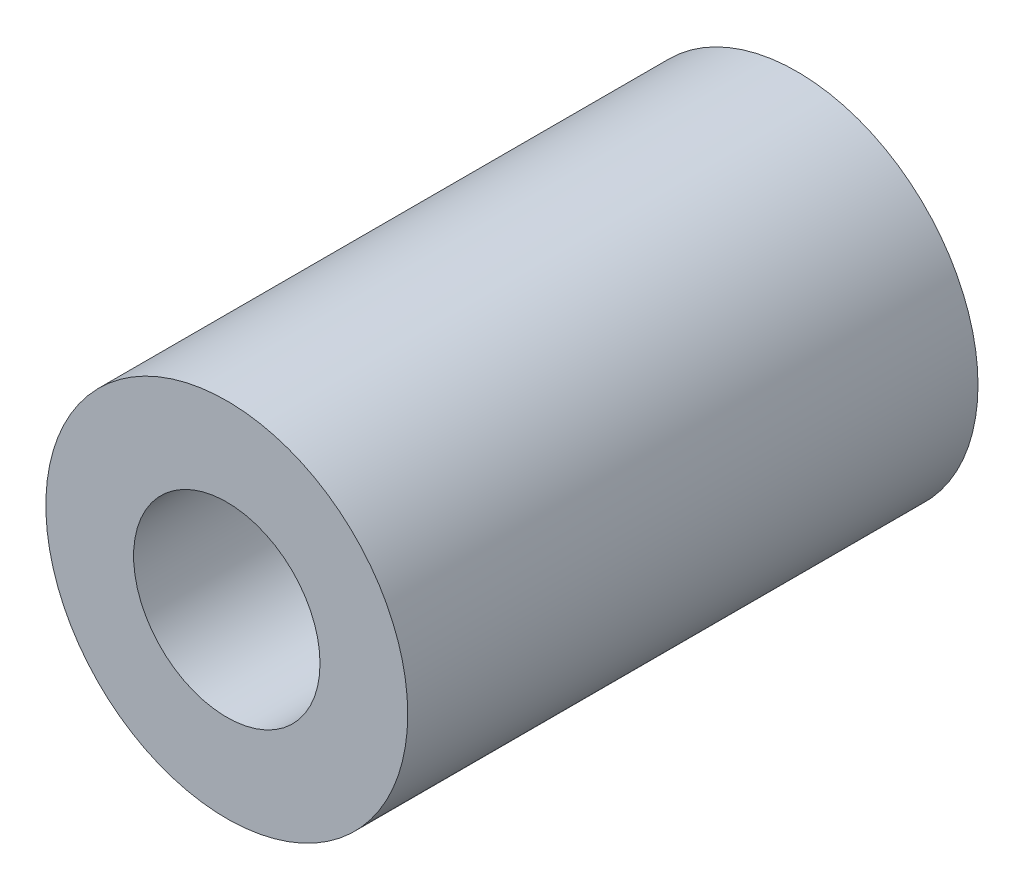
ISO-10303-21;
HEADER;
FILE_DESCRIPTION(('STEP AP214'),'2;1');
FILE_NAME('part.step','',(''),(''),'','','');
FILE_SCHEMA(('AUTOMOTIVE_DESIGN { 1 0 10303 214 1 1 1 1 }'));
ENDSEC;
DATA;
#1=APPLICATION_CONTEXT('core data for automotive mechanical design processes');
#2=APPLICATION_PROTOCOL_DEFINITION('international standard','automotive_design',2000,#1);
#3=PRODUCT_CONTEXT('',#1,'mechanical');
#4=PRODUCT('Part','Part','',(#3));
#5=PRODUCT_RELATED_PRODUCT_CATEGORY('part','',(#4));
#6=PRODUCT_DEFINITION_FORMATION('','',#4);
#7=PRODUCT_DEFINITION_CONTEXT('part definition',#1,'design');
#8=PRODUCT_DEFINITION('design','',#6,#7);
#9=PRODUCT_DEFINITION_SHAPE('','',#8);
#10=(LENGTH_UNIT() NAMED_UNIT(*) SI_UNIT(.MILLI.,.METRE.));
#11=(NAMED_UNIT(*) PLANE_ANGLE_UNIT() SI_UNIT($,.RADIAN.));
#12=(NAMED_UNIT(*) SI_UNIT($,.STERADIAN.) SOLID_ANGLE_UNIT());
#13=UNCERTAINTY_MEASURE_WITH_UNIT(LENGTH_MEASURE(1.E-05),#10,'distance_accuracy_value','');
#14=(GEOMETRIC_REPRESENTATION_CONTEXT(3) GLOBAL_UNCERTAINTY_ASSIGNED_CONTEXT((#13)) GLOBAL_UNIT_ASSIGNED_CONTEXT((#10,
#11,#12)) REPRESENTATION_CONTEXT('',''));
#15=CARTESIAN_POINT('',(0.,0.,0.));
#16=DIRECTION('',(0.,0.,1.));
#17=DIRECTION('',(1.,0.,0.));
#18=AXIS2_PLACEMENT_3D('',#15,#16,#17);
#19=CARTESIAN_POINT('',(0.,0.,10.4));
#20=DIRECTION('',(0.,0.,1.));
#21=DIRECTION('',(1.,0.,0.));
#22=AXIS2_PLACEMENT_3D('',#19,#20,#21);
#23=PLANE('',#22);
#24=CARTESIAN_POINT('',(0.,0.,10.4));
#25=DIRECTION('',(0.,0.,1.));
#26=DIRECTION('',(1.,0.,0.));
#27=AXIS2_PLACEMENT_3D('',#24,#25,#26);
#28=CIRCLE('',#27,3.3);
#29=CARTESIAN_POINT('',(3.3,0.,10.4));
#30=VERTEX_POINT('',#29);
#31=EDGE_CURVE('E10',#30,#30,#28,.T.);
#32=ORIENTED_EDGE('',*,*,#31,.T.);
#33=EDGE_LOOP('',(#32));
#34=FACE_BOUND('',#33,.T.);
#35=CARTESIAN_POINT('',(0.,0.,10.4));
#36=DIRECTION('',(0.,0.,1.));
#37=DIRECTION('',(1.,0.,0.));
#38=AXIS2_PLACEMENT_3D('',#35,#36,#37);
#39=CIRCLE('',#38,1.7);
#40=CARTESIAN_POINT('',(1.7,0.,10.4));
#41=VERTEX_POINT('',#40);
#42=EDGE_CURVE('E46',#41,#41,#39,.T.);
#43=ORIENTED_EDGE('',*,*,#42,.F.);
#44=EDGE_LOOP('',(#43));
#45=FACE_BOUND('',#44,.T.);
#46=ADVANCED_FACE('F35',(#34,#45),#23,.T.);
#47=CARTESIAN_POINT('',(0.,0.,0.));
#48=DIRECTION('',(0.,0.,1.));
#49=DIRECTION('',(1.,0.,0.));
#50=AXIS2_PLACEMENT_3D('',#47,#48,#49);
#51=PLANE('',#50);
#52=CARTESIAN_POINT('',(0.,0.,0.));
#53=DIRECTION('',(0.,0.,1.));
#54=DIRECTION('',(1.,0.,0.));
#55=AXIS2_PLACEMENT_3D('',#52,#53,#54);
#56=CIRCLE('',#55,3.3);
#57=CARTESIAN_POINT('',(3.3,0.,0.));
#58=VERTEX_POINT('',#57);
#59=EDGE_CURVE('E39',#58,#58,#56,.T.);
#60=ORIENTED_EDGE('',*,*,#59,.F.);
#61=EDGE_LOOP('',(#60));
#62=FACE_BOUND('',#61,.T.);
#63=CARTESIAN_POINT('',(0.,0.,0.));
#64=DIRECTION('',(0.,0.,1.));
#65=DIRECTION('',(1.,0.,0.));
#66=AXIS2_PLACEMENT_3D('',#63,#64,#65);
#67=CIRCLE('',#66,1.7);
#68=CARTESIAN_POINT('',(1.7,0.,0.));
#69=VERTEX_POINT('',#68);
#70=EDGE_CURVE('E48',#69,#69,#67,.T.);
#71=ORIENTED_EDGE('',*,*,#70,.T.);
#72=EDGE_LOOP('',(#71));
#73=FACE_BOUND('',#72,.T.);
#74=ADVANCED_FACE('F58',(#62,#73),#51,.F.);
#75=CARTESIAN_POINT('',(0.,0.,10.4));
#76=DIRECTION('',(0.,0.,-1.));
#77=DIRECTION('',(-1.,0.,0.));
#78=AXIS2_PLACEMENT_3D('',#75,#76,#77);
#79=CYLINDRICAL_SURFACE('',#78,3.3);
#80=ORIENTED_EDGE('',*,*,#31,.F.);
#81=EDGE_LOOP('',(#80));
#82=FACE_BOUND('',#81,.T.);
#83=ORIENTED_EDGE('',*,*,#59,.T.);
#84=EDGE_LOOP('',(#83));
#85=FACE_BOUND('',#84,.T.);
#86=ADVANCED_FACE('F37',(#82,#85),#79,.T.);
#87=CARTESIAN_POINT('',(0.,0.,10.4));
#88=DIRECTION('',(0.,0.,-1.));
#89=DIRECTION('',(-1.,0.,0.));
#90=AXIS2_PLACEMENT_3D('',#87,#88,#89);
#91=CYLINDRICAL_SURFACE('',#90,1.7);
#92=ORIENTED_EDGE('',*,*,#42,.T.);
#93=EDGE_LOOP('',(#92));
#94=FACE_BOUND('',#93,.T.);
#95=ORIENTED_EDGE('',*,*,#70,.F.);
#96=EDGE_LOOP('',(#95));
#97=FACE_BOUND('',#96,.T.);
#98=ADVANCED_FACE('F54',(#94,#97),#91,.F.);
#99=CLOSED_SHELL('',(#46,#74,#86,#98));
#100=MANIFOLD_SOLID_BREP('B2',#99);
#101=ADVANCED_BREP_SHAPE_REPRESENTATION('',(#18,#100),#14);
#102=SHAPE_DEFINITION_REPRESENTATION(#9,#101);
ENDSEC;
END-ISO-10303-21;
